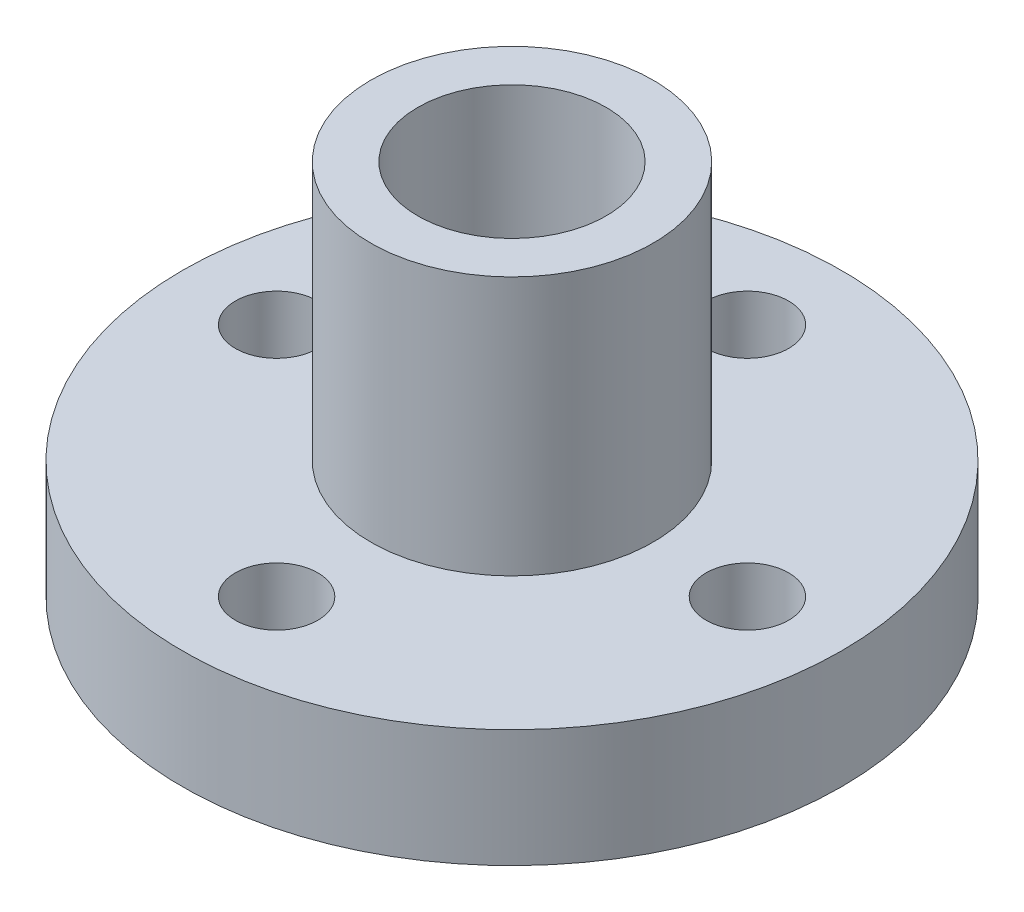
ISO-10303-21;
HEADER;
FILE_DESCRIPTION(('STEP AP214'),'2;1');
FILE_NAME('part.step','',(''),(''),'','','');
FILE_SCHEMA(('AUTOMOTIVE_DESIGN { 1 0 10303 214 1 1 1 1 }'));
ENDSEC;
DATA;
#1=APPLICATION_CONTEXT('core data for automotive mechanical design processes');
#2=APPLICATION_PROTOCOL_DEFINITION('international standard','automotive_design',2000,#1);
#3=PRODUCT_CONTEXT('',#1,'mechanical');
#4=PRODUCT('Part','Part','',(#3));
#5=PRODUCT_RELATED_PRODUCT_CATEGORY('part','',(#4));
#6=PRODUCT_DEFINITION_FORMATION('','',#4);
#7=PRODUCT_DEFINITION_CONTEXT('part definition',#1,'design');
#8=PRODUCT_DEFINITION('design','',#6,#7);
#9=PRODUCT_DEFINITION_SHAPE('','',#8);
#10=(LENGTH_UNIT() NAMED_UNIT(*) SI_UNIT(.MILLI.,.METRE.));
#11=(NAMED_UNIT(*) PLANE_ANGLE_UNIT() SI_UNIT($,.RADIAN.));
#12=(NAMED_UNIT(*) SI_UNIT($,.STERADIAN.) SOLID_ANGLE_UNIT());
#13=UNCERTAINTY_MEASURE_WITH_UNIT(LENGTH_MEASURE(1.E-05),#10,'distance_accuracy_value','');
#14=(GEOMETRIC_REPRESENTATION_CONTEXT(3) GLOBAL_UNCERTAINTY_ASSIGNED_CONTEXT((#13)) GLOBAL_UNIT_ASSIGNED_CONTEXT((#10,
#11,#12)) REPRESENTATION_CONTEXT('',''));
#15=CARTESIAN_POINT('',(0.,0.,0.));
#16=DIRECTION('',(0.,0.,1.));
#17=DIRECTION('',(1.,0.,0.));
#18=AXIS2_PLACEMENT_3D('',#15,#16,#17);
#19=CARTESIAN_POINT('',(0.,8.11999999999998,0.));
#20=DIRECTION('',(0.,1.,0.));
#21=DIRECTION('',(-1.,0.,0.));
#22=AXIS2_PLACEMENT_3D('',#19,#20,#21);
#23=CYLINDRICAL_SURFACE('',#22,4.);
#24=CARTESIAN_POINT('',(0.,14.1866666666667,0.));
#25=DIRECTION('',(0.,1.,0.));
#26=DIRECTION('',(-1.,0.,0.));
#27=AXIS2_PLACEMENT_3D('',#24,#25,#26);
#28=CIRCLE('',#27,4.);
#29=CARTESIAN_POINT('',(-4.,14.1866666666667,0.));
#30=VERTEX_POINT('',#29);
#31=EDGE_CURVE('E55',#30,#30,#28,.T.);
#32=ORIENTED_EDGE('',*,*,#31,.T.);
#33=EDGE_LOOP('',(#32));
#34=FACE_BOUND('',#33,.T.);
#35=CARTESIAN_POINT('',(0.,-1.81333333333334,0.));
#36=DIRECTION('',(0.,1.,0.));
#37=DIRECTION('',(-1.,0.,0.));
#38=AXIS2_PLACEMENT_3D('',#35,#36,#37);
#39=CIRCLE('',#38,4.);
#40=CARTESIAN_POINT('',(-4.,-1.81333333333334,0.));
#41=VERTEX_POINT('',#40);
#42=EDGE_CURVE('E10',#41,#41,#39,.T.);
#43=ORIENTED_EDGE('',*,*,#42,.F.);
#44=EDGE_LOOP('',(#43));
#45=FACE_BOUND('',#44,.T.);
#46=ADVANCED_FACE('F33',(#34,#45),#23,.F.);
#47=CARTESIAN_POINT('',(-4.,-1.81333333333334,0.));
#48=DIRECTION('',(0.,-1.,0.));
#49=DIRECTION('',(1.,0.,0.));
#50=AXIS2_PLACEMENT_3D('',#47,#48,#49);
#51=PLANE('',#50);
#52=CARTESIAN_POINT('',(0.,-1.81333333333334,-10.));
#53=DIRECTION('',(0.,1.,0.));
#54=DIRECTION('',(-1.,0.,0.));
#55=AXIS2_PLACEMENT_3D('',#52,#53,#54);
#56=CIRCLE('',#55,1.75);
#57=CARTESIAN_POINT('',(-1.75,-1.81333333333334,-10.));
#58=VERTEX_POINT('',#57);
#59=EDGE_CURVE('E58',#58,#58,#56,.T.);
#60=ORIENTED_EDGE('',*,*,#59,.T.);
#61=EDGE_LOOP('',(#60));
#62=FACE_BOUND('',#61,.T.);
#63=CARTESIAN_POINT('',(10.0000000000003,-1.81333333333334,-2.82380124105319E-13));
#64=DIRECTION('',(0.,1.,0.));
#65=DIRECTION('',(-1.,0.,0.));
#66=AXIS2_PLACEMENT_3D('',#63,#64,#65);
#67=CIRCLE('',#66,1.75000000000022);
#68=CARTESIAN_POINT('',(8.25000000000006,-1.81333333333334,-2.82380124105319E-13));
#69=VERTEX_POINT('',#68);
#70=EDGE_CURVE('E74',#69,#69,#67,.T.);
#71=ORIENTED_EDGE('',*,*,#70,.T.);
#72=EDGE_LOOP('',(#71));
#73=FACE_BOUND('',#72,.T.);
#74=CARTESIAN_POINT('',(5.64983209672282E-13,-1.81333333333334,10.));
#75=DIRECTION('',(0.,1.,0.));
#76=DIRECTION('',(-1.,0.,0.));
#77=AXIS2_PLACEMENT_3D('',#74,#75,#76);
#78=CIRCLE('',#77,1.75000000000061);
#79=CARTESIAN_POINT('',(-1.75000000000004,-1.81333333333334,10.));
#80=VERTEX_POINT('',#79);
#81=EDGE_CURVE('E68',#80,#80,#78,.T.);
#82=ORIENTED_EDGE('',*,*,#81,.T.);
#83=EDGE_LOOP('',(#82));
#84=FACE_BOUND('',#83,.T.);
#85=CARTESIAN_POINT('',(-9.99999999999972,-1.81333333333334,2.83604770904466E-13));
#86=DIRECTION('',(0.,1.,0.));
#87=DIRECTION('',(-1.,0.,0.));
#88=AXIS2_PLACEMENT_3D('',#85,#86,#87);
#89=CIRCLE('',#88,1.75000000000045);
#90=CARTESIAN_POINT('',(-11.7500000000002,-1.81333333333334,2.83604770904466E-13));
#91=VERTEX_POINT('',#90);
#92=EDGE_CURVE('E62',#91,#91,#89,.T.);
#93=ORIENTED_EDGE('',*,*,#92,.T.);
#94=EDGE_LOOP('',(#93));
#95=FACE_BOUND('',#94,.T.);
#96=ORIENTED_EDGE('',*,*,#42,.T.);
#97=EDGE_LOOP('',(#96));
#98=FACE_BOUND('',#97,.T.);
#99=CARTESIAN_POINT('',(0.,-1.81333333333334,0.));
#100=DIRECTION('',(0.,1.,0.));
#101=DIRECTION('',(-1.,0.,0.));
#102=AXIS2_PLACEMENT_3D('',#99,#100,#101);
#103=CIRCLE('',#102,14.);
#104=CARTESIAN_POINT('',(-14.,-1.81333333333334,0.));
#105=VERTEX_POINT('',#104);
#106=EDGE_CURVE('E39',#105,#105,#103,.T.);
#107=ORIENTED_EDGE('',*,*,#106,.F.);
#108=EDGE_LOOP('',(#107));
#109=FACE_BOUND('',#108,.T.);
#110=ADVANCED_FACE('F83',(#62,#73,#84,#95,#98,#109),#51,.T.);
#111=CARTESIAN_POINT('',(0.,8.11999999999998,0.));
#112=DIRECTION('',(0.,1.,0.));
#113=DIRECTION('',(-1.,0.,0.));
#114=AXIS2_PLACEMENT_3D('',#111,#112,#113);
#115=CYLINDRICAL_SURFACE('',#114,14.);
#116=ORIENTED_EDGE('',*,*,#106,.T.);
#117=EDGE_LOOP('',(#116));
#118=FACE_BOUND('',#117,.T.);
#119=CARTESIAN_POINT('',(0.,3.18666666666666,0.));
#120=DIRECTION('',(0.,1.,0.));
#121=DIRECTION('',(-1.,0.,0.));
#122=AXIS2_PLACEMENT_3D('',#119,#120,#121);
#123=CIRCLE('',#122,14.);
#124=CARTESIAN_POINT('',(-14.,3.18666666666666,0.));
#125=VERTEX_POINT('',#124);
#126=EDGE_CURVE('E43',#125,#125,#123,.T.);
#127=ORIENTED_EDGE('',*,*,#126,.F.);
#128=EDGE_LOOP('',(#127));
#129=FACE_BOUND('',#128,.T.);
#130=ADVANCED_FACE('F97',(#118,#129),#115,.T.);
#131=CARTESIAN_POINT('',(-14.,3.18666666666666,0.));
#132=DIRECTION('',(0.,1.,0.));
#133=DIRECTION('',(-1.,0.,0.));
#134=AXIS2_PLACEMENT_3D('',#131,#132,#133);
#135=PLANE('',#134);
#136=CARTESIAN_POINT('',(0.,3.18666666666666,-10.));
#137=DIRECTION('',(0.,1.,0.));
#138=DIRECTION('',(-1.,0.,0.));
#139=AXIS2_PLACEMENT_3D('',#136,#137,#138);
#140=CIRCLE('',#139,1.75);
#141=CARTESIAN_POINT('',(-1.75,3.18666666666666,-10.));
#142=VERTEX_POINT('',#141);
#143=EDGE_CURVE('E77',#142,#142,#140,.T.);
#144=ORIENTED_EDGE('',*,*,#143,.F.);
#145=EDGE_LOOP('',(#144));
#146=FACE_BOUND('',#145,.T.);
#147=CARTESIAN_POINT('',(10.0000000000003,3.18666666666666,-2.82380124105319E-13));
#148=DIRECTION('',(0.,1.,0.));
#149=DIRECTION('',(-1.,0.,0.));
#150=AXIS2_PLACEMENT_3D('',#147,#148,#149);
#151=CIRCLE('',#150,1.75000000000022);
#152=CARTESIAN_POINT('',(8.25000000000006,3.18666666666666,-2.82380124105319E-13));
#153=VERTEX_POINT('',#152);
#154=EDGE_CURVE('E71',#153,#153,#151,.T.);
#155=ORIENTED_EDGE('',*,*,#154,.F.);
#156=EDGE_LOOP('',(#155));
#157=FACE_BOUND('',#156,.T.);
#158=CARTESIAN_POINT('',(5.64368426230249E-13,3.18666666666666,10.));
#159=DIRECTION('',(0.,1.,0.));
#160=DIRECTION('',(-1.,0.,0.));
#161=AXIS2_PLACEMENT_3D('',#158,#159,#160);
#162=CIRCLE('',#161,1.75000000000061);
#163=CARTESIAN_POINT('',(-1.75000000000004,3.18666666666666,10.));
#164=VERTEX_POINT('',#163);
#165=EDGE_CURVE('E65',#164,#164,#162,.T.);
#166=ORIENTED_EDGE('',*,*,#165,.F.);
#167=EDGE_LOOP('',(#166));
#168=FACE_BOUND('',#167,.T.);
#169=CARTESIAN_POINT('',(-9.99999999999972,3.18666666666666,2.83604770904466E-13));
#170=DIRECTION('',(0.,1.,0.));
#171=DIRECTION('',(-1.,0.,0.));
#172=AXIS2_PLACEMENT_3D('',#169,#170,#171);
#173=CIRCLE('',#172,1.75000000000045);
#174=CARTESIAN_POINT('',(-11.7500000000002,3.18666666666666,2.83604770904466E-13));
#175=VERTEX_POINT('',#174);
#176=EDGE_CURVE('E59',#175,#175,#173,.T.);
#177=ORIENTED_EDGE('',*,*,#176,.F.);
#178=EDGE_LOOP('',(#177));
#179=FACE_BOUND('',#178,.T.);
#180=ORIENTED_EDGE('',*,*,#126,.T.);
#181=EDGE_LOOP('',(#180));
#182=FACE_BOUND('',#181,.T.);
#183=CARTESIAN_POINT('',(0.,3.18666666666666,0.));
#184=DIRECTION('',(0.,1.,0.));
#185=DIRECTION('',(-1.,0.,0.));
#186=AXIS2_PLACEMENT_3D('',#183,#184,#185);
#187=CIRCLE('',#186,6.);
#188=CARTESIAN_POINT('',(-6.,3.18666666666666,0.));
#189=VERTEX_POINT('',#188);
#190=EDGE_CURVE('E47',#189,#189,#187,.T.);
#191=ORIENTED_EDGE('',*,*,#190,.F.);
#192=EDGE_LOOP('',(#191));
#193=FACE_BOUND('',#192,.T.);
#194=ADVANCED_FACE('F93',(#146,#157,#168,#179,#182,#193),#135,.T.);
#195=CARTESIAN_POINT('',(0.,8.11999999999998,0.));
#196=DIRECTION('',(0.,1.,0.));
#197=DIRECTION('',(-1.,0.,0.));
#198=AXIS2_PLACEMENT_3D('',#195,#196,#197);
#199=CYLINDRICAL_SURFACE('',#198,6.);
#200=ORIENTED_EDGE('',*,*,#190,.T.);
#201=EDGE_LOOP('',(#200));
#202=FACE_BOUND('',#201,.T.);
#203=CARTESIAN_POINT('',(0.,14.1866666666667,0.));
#204=DIRECTION('',(0.,1.,0.));
#205=DIRECTION('',(-1.,0.,0.));
#206=AXIS2_PLACEMENT_3D('',#203,#204,#205);
#207=CIRCLE('',#206,6.);
#208=CARTESIAN_POINT('',(-6.,14.1866666666667,0.));
#209=VERTEX_POINT('',#208);
#210=EDGE_CURVE('E52',#209,#209,#207,.T.);
#211=ORIENTED_EDGE('',*,*,#210,.F.);
#212=EDGE_LOOP('',(#211));
#213=FACE_BOUND('',#212,.T.);
#214=ADVANCED_FACE('F96',(#202,#213),#199,.T.);
#215=CARTESIAN_POINT('',(-6.,14.1866666666667,0.));
#216=DIRECTION('',(0.,1.,0.));
#217=DIRECTION('',(-1.,0.,0.));
#218=AXIS2_PLACEMENT_3D('',#215,#216,#217);
#219=PLANE('',#218);
#220=ORIENTED_EDGE('',*,*,#210,.T.);
#221=EDGE_LOOP('',(#220));
#222=FACE_BOUND('',#221,.T.);
#223=ORIENTED_EDGE('',*,*,#31,.F.);
#224=EDGE_LOOP('',(#223));
#225=FACE_BOUND('',#224,.T.);
#226=ADVANCED_FACE('F111',(#222,#225),#219,.T.);
#227=CARTESIAN_POINT('',(-9.99999999999972,-1.81333333333334,2.83604770904466E-13));
#228=DIRECTION('',(0.,1.,0.));
#229=DIRECTION('',(-1.,0.,0.));
#230=AXIS2_PLACEMENT_3D('',#227,#228,#229);
#231=CYLINDRICAL_SURFACE('',#230,1.75000000000045);
#232=ORIENTED_EDGE('',*,*,#92,.F.);
#233=EDGE_LOOP('',(#232));
#234=FACE_BOUND('',#233,.T.);
#235=ORIENTED_EDGE('',*,*,#176,.T.);
#236=EDGE_LOOP('',(#235));
#237=FACE_BOUND('',#236,.T.);
#238=ADVANCED_FACE('F117',(#234,#237),#231,.F.);
#239=CARTESIAN_POINT('',(5.64983209672282E-13,-1.81333333333334,10.));
#240=DIRECTION('',(0.,1.,0.));
#241=DIRECTION('',(-1.,0.,0.));
#242=AXIS2_PLACEMENT_3D('',#239,#240,#241);
#243=CYLINDRICAL_SURFACE('',#242,1.75000000000061);
#244=ORIENTED_EDGE('',*,*,#81,.F.);
#245=EDGE_LOOP('',(#244));
#246=FACE_BOUND('',#245,.T.);
#247=ORIENTED_EDGE('',*,*,#165,.T.);
#248=EDGE_LOOP('',(#247));
#249=FACE_BOUND('',#248,.T.);
#250=ADVANCED_FACE('F133',(#246,#249),#243,.F.);
#251=CARTESIAN_POINT('',(10.0000000000003,-1.81333333333334,-2.82380124105319E-13));
#252=DIRECTION('',(0.,1.,0.));
#253=DIRECTION('',(-1.,0.,0.));
#254=AXIS2_PLACEMENT_3D('',#251,#252,#253);
#255=CYLINDRICAL_SURFACE('',#254,1.75000000000022);
#256=ORIENTED_EDGE('',*,*,#70,.F.);
#257=EDGE_LOOP('',(#256));
#258=FACE_BOUND('',#257,.T.);
#259=ORIENTED_EDGE('',*,*,#154,.T.);
#260=EDGE_LOOP('',(#259));
#261=FACE_BOUND('',#260,.T.);
#262=ADVANCED_FACE('F89',(#258,#261),#255,.F.);
#263=CARTESIAN_POINT('',(0.,-1.81333333333334,-10.));
#264=DIRECTION('',(0.,1.,0.));
#265=DIRECTION('',(-1.,0.,0.));
#266=AXIS2_PLACEMENT_3D('',#263,#264,#265);
#267=CYLINDRICAL_SURFACE('',#266,1.75);
#268=ORIENTED_EDGE('',*,*,#59,.F.);
#269=EDGE_LOOP('',(#268));
#270=FACE_BOUND('',#269,.T.);
#271=ORIENTED_EDGE('',*,*,#143,.T.);
#272=EDGE_LOOP('',(#271));
#273=FACE_BOUND('',#272,.T.);
#274=ADVANCED_FACE('F86',(#270,#273),#267,.F.);
#275=CLOSED_SHELL('',(#46,#110,#130,#194,#214,#226,#238,#250,#262,#274));
#276=MANIFOLD_SOLID_BREP('B2',#275);
#277=ADVANCED_BREP_SHAPE_REPRESENTATION('',(#18,#276),#14);
#278=SHAPE_DEFINITION_REPRESENTATION(#9,#277);
ENDSEC;
END-ISO-10303-21;
